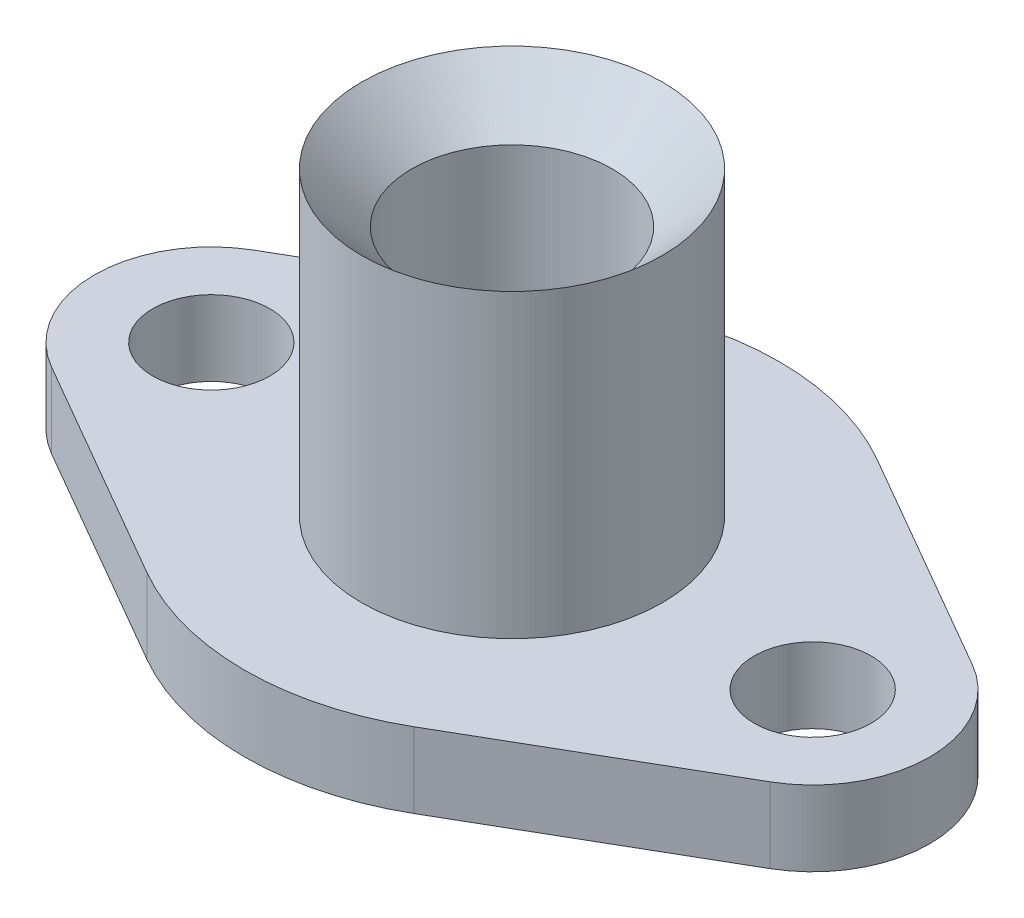
ISO-10303-21;
HEADER;
FILE_DESCRIPTION(('STEP AP214'),'2;1');
FILE_NAME('part.step','',(''),(''),'','','');
FILE_SCHEMA(('AUTOMOTIVE_DESIGN { 1 0 10303 214 1 1 1 1 }'));
ENDSEC;
DATA;
#1=APPLICATION_CONTEXT('core data for automotive mechanical design processes');
#2=APPLICATION_PROTOCOL_DEFINITION('international standard','automotive_design',2000,#1);
#3=PRODUCT_CONTEXT('',#1,'mechanical');
#4=PRODUCT('Part','Part','',(#3));
#5=PRODUCT_RELATED_PRODUCT_CATEGORY('part','',(#4));
#6=PRODUCT_DEFINITION_FORMATION('','',#4);
#7=PRODUCT_DEFINITION_CONTEXT('part definition',#1,'design');
#8=PRODUCT_DEFINITION('design','',#6,#7);
#9=PRODUCT_DEFINITION_SHAPE('','',#8);
#10=(LENGTH_UNIT() NAMED_UNIT(*) SI_UNIT(.MILLI.,.METRE.));
#11=(NAMED_UNIT(*) PLANE_ANGLE_UNIT() SI_UNIT($,.RADIAN.));
#12=(NAMED_UNIT(*) SI_UNIT($,.STERADIAN.) SOLID_ANGLE_UNIT());
#13=UNCERTAINTY_MEASURE_WITH_UNIT(LENGTH_MEASURE(1.E-05),#10,'distance_accuracy_value','');
#14=(GEOMETRIC_REPRESENTATION_CONTEXT(3) GLOBAL_UNCERTAINTY_ASSIGNED_CONTEXT((#13)) GLOBAL_UNIT_ASSIGNED_CONTEXT((#10,
#11,#12)) REPRESENTATION_CONTEXT('',''));
#15=CARTESIAN_POINT('',(0.,0.,0.));
#16=DIRECTION('',(0.,0.,1.));
#17=DIRECTION('',(1.,0.,0.));
#18=AXIS2_PLACEMENT_3D('',#15,#16,#17);
#19=CARTESIAN_POINT('',(-53.082252649215,9.,-67.5974700843521));
#20=DIRECTION('',(0.5,0.,-0.866025403784439));
#21=DIRECTION('',(-0.866025403784439,0.,-0.5));
#22=AXIS2_PLACEMENT_3D('',#19,#20,#21);
#23=PLANE('',#22);
#24=DIRECTION('',(0.866025403784439,0.,0.5));
#25=VECTOR('',#24,1.);
#26=CARTESIAN_POINT('',(-53.082252649215,0.,-67.5974700843521));
#27=LINE('',#26,#25);
#28=CARTESIAN_POINT('',(16.,0.,-27.712812921102));
#29=VERTEX_POINT('',#28);
#30=CARTESIAN_POINT('',(43.,0.,-12.1243556529821));
#31=VERTEX_POINT('',#30);
#32=EDGE_CURVE('E191',#29,#31,#27,.T.);
#33=ORIENTED_EDGE('',*,*,#32,.F.);
#34=DIRECTION('',(0.,-1.,0.));
#35=VECTOR('',#34,1.);
#36=CARTESIAN_POINT('',(16.,9.,-27.712812921102));
#37=LINE('',#36,#35);
#38=CARTESIAN_POINT('',(16.,9.,-27.712812921102));
#39=VERTEX_POINT('',#38);
#40=EDGE_CURVE('E87',#39,#29,#37,.T.);
#41=ORIENTED_EDGE('',*,*,#40,.F.);
#42=DIRECTION('',(0.866025403784439,0.,0.5));
#43=VECTOR('',#42,1.);
#44=CARTESIAN_POINT('',(-53.082252649215,9.,-67.5974700843521));
#45=LINE('',#44,#43);
#46=CARTESIAN_POINT('',(43.,9.,-12.1243556529821));
#47=VERTEX_POINT('',#46);
#48=EDGE_CURVE('E233',#39,#47,#45,.T.);
#49=ORIENTED_EDGE('',*,*,#48,.T.);
#50=DIRECTION('',(0.,-1.,0.));
#51=VECTOR('',#50,1.);
#52=CARTESIAN_POINT('',(43.,9.,-12.1243556529821));
#53=LINE('',#52,#51);
#54=EDGE_CURVE('E83',#47,#31,#53,.T.);
#55=ORIENTED_EDGE('',*,*,#54,.T.);
#56=EDGE_LOOP('',(#33,#41,#49,#55));
#57=FACE_BOUND('',#56,.T.);
#58=ADVANCED_FACE('F31',(#57),#23,.T.);
#59=CARTESIAN_POINT('',(0.,9.,0.));
#60=DIRECTION('',(0.,-1.,0.));
#61=DIRECTION('',(0.,0.,-1.));
#62=AXIS2_PLACEMENT_3D('',#59,#60,#61);
#63=CYLINDRICAL_SURFACE('',#62,32.);
#64=CARTESIAN_POINT('',(0.,0.,0.));
#65=DIRECTION('',(0.,1.,0.));
#66=DIRECTION('',(0.,0.,1.));
#67=AXIS2_PLACEMENT_3D('',#64,#65,#66);
#68=CIRCLE('',#67,32.);
#69=CARTESIAN_POINT('',(-16.,0.,-27.712812921102));
#70=VERTEX_POINT('',#69);
#71=EDGE_CURVE('E194',#29,#70,#68,.T.);
#72=ORIENTED_EDGE('',*,*,#71,.T.);
#73=DIRECTION('',(0.,-1.,0.));
#74=VECTOR('',#73,1.);
#75=CARTESIAN_POINT('',(-16.,9.,-27.712812921102));
#76=LINE('',#75,#74);
#77=CARTESIAN_POINT('',(-16.,9.,-27.712812921102));
#78=VERTEX_POINT('',#77);
#79=EDGE_CURVE('E137',#78,#70,#76,.T.);
#80=ORIENTED_EDGE('',*,*,#79,.F.);
#81=CARTESIAN_POINT('',(0.,9.,0.));
#82=DIRECTION('',(0.,1.,0.));
#83=DIRECTION('',(0.,0.,1.));
#84=AXIS2_PLACEMENT_3D('',#81,#82,#83);
#85=CIRCLE('',#84,32.);
#86=EDGE_CURVE('E123',#39,#78,#85,.T.);
#87=ORIENTED_EDGE('',*,*,#86,.F.);
#88=ORIENTED_EDGE('',*,*,#40,.T.);
#89=EDGE_LOOP('',(#72,#80,#87,#88));
#90=FACE_BOUND('',#89,.T.);
#91=ADVANCED_FACE('F158',(#90),#63,.T.);
#92=CARTESIAN_POINT('',(-85.082252649215,9.,12.171844242148));
#93=DIRECTION('',(0.5,0.,0.866025403784439));
#94=DIRECTION('',(0.866025403784439,0.,-0.5));
#95=AXIS2_PLACEMENT_3D('',#92,#93,#94);
#96=PLANE('',#95);
#97=DIRECTION('',(-0.866025403784439,0.,0.5));
#98=VECTOR('',#97,1.);
#99=CARTESIAN_POINT('',(-85.082252649215,0.,12.171844242148));
#100=LINE('',#99,#98);
#101=CARTESIAN_POINT('',(-43.,0.,-12.1243556529821));
#102=VERTEX_POINT('',#101);
#103=EDGE_CURVE('E203',#70,#102,#100,.T.);
#104=ORIENTED_EDGE('',*,*,#103,.T.);
#105=DIRECTION('',(0.,-1.,0.));
#106=VECTOR('',#105,1.);
#107=CARTESIAN_POINT('',(-43.,9.,-12.1243556529821));
#108=LINE('',#107,#106);
#109=CARTESIAN_POINT('',(-43.,9.,-12.1243556529821));
#110=VERTEX_POINT('',#109);
#111=EDGE_CURVE('E135',#110,#102,#108,.T.);
#112=ORIENTED_EDGE('',*,*,#111,.F.);
#113=DIRECTION('',(-0.866025403784439,0.,0.5));
#114=VECTOR('',#113,1.);
#115=CARTESIAN_POINT('',(-85.082252649215,9.,12.171844242148));
#116=LINE('',#115,#114);
#117=EDGE_CURVE('E230',#78,#110,#116,.T.);
#118=ORIENTED_EDGE('',*,*,#117,.F.);
#119=ORIENTED_EDGE('',*,*,#79,.T.);
#120=EDGE_LOOP('',(#104,#112,#118,#119));
#121=FACE_BOUND('',#120,.T.);
#122=ADVANCED_FACE('F163',(#121),#96,.F.);
#123=CARTESIAN_POINT('',(-36.,9.,0.));
#124=DIRECTION('',(0.,-1.,0.));
#125=DIRECTION('',(0.,0.,-1.));
#126=AXIS2_PLACEMENT_3D('',#123,#124,#125);
#127=CYLINDRICAL_SURFACE('',#126,14.);
#128=CARTESIAN_POINT('',(-36.,0.,0.));
#129=DIRECTION('',(0.,1.,0.));
#130=DIRECTION('',(0.,0.,1.));
#131=AXIS2_PLACEMENT_3D('',#128,#129,#130);
#132=CIRCLE('',#131,14.);
#133=CARTESIAN_POINT('',(-43.,0.,12.1243556529821));
#134=VERTEX_POINT('',#133);
#135=EDGE_CURVE('E206',#134,#102,#132,.F.);
#136=ORIENTED_EDGE('',*,*,#135,.F.);
#137=DIRECTION('',(0.,-1.,0.));
#138=VECTOR('',#137,1.);
#139=CARTESIAN_POINT('',(-43.,9.,12.1243556529821));
#140=LINE('',#139,#138);
#141=CARTESIAN_POINT('',(-43.,9.,12.1243556529821));
#142=VERTEX_POINT('',#141);
#143=EDGE_CURVE('E129',#142,#134,#140,.T.);
#144=ORIENTED_EDGE('',*,*,#143,.F.);
#145=CARTESIAN_POINT('',(-36.,9.,0.));
#146=DIRECTION('',(0.,1.,0.));
#147=DIRECTION('',(0.,0.,1.));
#148=AXIS2_PLACEMENT_3D('',#145,#146,#147);
#149=CIRCLE('',#148,14.);
#150=EDGE_CURVE('E227',#142,#110,#149,.F.);
#151=ORIENTED_EDGE('',*,*,#150,.T.);
#152=ORIENTED_EDGE('',*,*,#111,.T.);
#153=EDGE_LOOP('',(#136,#144,#151,#152));
#154=FACE_BOUND('',#153,.T.);
#155=ADVANCED_FACE('F241',(#154),#127,.T.);
#156=CARTESIAN_POINT('',(-85.082252649215,9.,-12.171844242148));
#157=DIRECTION('',(-0.5,0.,0.866025403784439));
#158=DIRECTION('',(0.866025403784439,0.,0.5));
#159=AXIS2_PLACEMENT_3D('',#156,#157,#158);
#160=PLANE('',#159);
#161=DIRECTION('',(-0.866025403784439,0.,-0.5));
#162=VECTOR('',#161,1.);
#163=CARTESIAN_POINT('',(-85.082252649215,0.,-12.171844242148));
#164=LINE('',#163,#162);
#165=CARTESIAN_POINT('',(-16.,0.,27.712812921102));
#166=VERTEX_POINT('',#165);
#167=EDGE_CURVE('E209',#166,#134,#164,.T.);
#168=ORIENTED_EDGE('',*,*,#167,.F.);
#169=DIRECTION('',(0.,-1.,0.));
#170=VECTOR('',#169,1.);
#171=CARTESIAN_POINT('',(-16.,9.,27.712812921102));
#172=LINE('',#171,#170);
#173=CARTESIAN_POINT('',(-16.,9.,27.712812921102));
#174=VERTEX_POINT('',#173);
#175=EDGE_CURVE('E127',#174,#166,#172,.T.);
#176=ORIENTED_EDGE('',*,*,#175,.F.);
#177=DIRECTION('',(-0.866025403784439,0.,-0.5));
#178=VECTOR('',#177,1.);
#179=CARTESIAN_POINT('',(-85.082252649215,9.,-12.171844242148));
#180=LINE('',#179,#178);
#181=EDGE_CURVE('E120',#174,#142,#180,.T.);
#182=ORIENTED_EDGE('',*,*,#181,.T.);
#183=ORIENTED_EDGE('',*,*,#143,.T.);
#184=EDGE_LOOP('',(#168,#176,#182,#183));
#185=FACE_BOUND('',#184,.T.);
#186=ADVANCED_FACE('F244',(#185),#160,.T.);
#187=CARTESIAN_POINT('',(16.,0.,27.712812921102));
#188=VERTEX_POINT('',#187);
#189=EDGE_CURVE('E126',#166,#188,#68,.T.);
#190=ORIENTED_EDGE('',*,*,#189,.T.);
#191=DIRECTION('',(0.,-1.,0.));
#192=VECTOR('',#191,1.);
#193=CARTESIAN_POINT('',(16.,9.,27.712812921102));
#194=LINE('',#193,#192);
#195=CARTESIAN_POINT('',(16.,9.,27.712812921102));
#196=VERTEX_POINT('',#195);
#197=EDGE_CURVE('E109',#196,#188,#194,.T.);
#198=ORIENTED_EDGE('',*,*,#197,.F.);
#199=EDGE_CURVE('E112',#174,#196,#85,.T.);
#200=ORIENTED_EDGE('',*,*,#199,.F.);
#201=ORIENTED_EDGE('',*,*,#175,.T.);
#202=EDGE_LOOP('',(#190,#198,#200,#201));
#203=FACE_BOUND('',#202,.T.);
#204=ADVANCED_FACE('F124',(#203),#63,.T.);
#205=CARTESIAN_POINT('',(-53.082252649215,9.,67.5974700843521));
#206=DIRECTION('',(-0.5,0.,-0.866025403784439));
#207=DIRECTION('',(-0.866025403784439,0.,0.5));
#208=AXIS2_PLACEMENT_3D('',#205,#206,#207);
#209=PLANE('',#208);
#210=DIRECTION('',(0.866025403784439,0.,-0.5));
#211=VECTOR('',#210,1.);
#212=CARTESIAN_POINT('',(-53.082252649215,0.,67.5974700843521));
#213=LINE('',#212,#211);
#214=CARTESIAN_POINT('',(43.,0.,12.1243556529821));
#215=VERTEX_POINT('',#214);
#216=EDGE_CURVE('E212',#188,#215,#213,.T.);
#217=ORIENTED_EDGE('',*,*,#216,.T.);
#218=DIRECTION('',(0.,-1.,0.));
#219=VECTOR('',#218,1.);
#220=CARTESIAN_POINT('',(43.,9.,12.1243556529821));
#221=LINE('',#220,#219);
#222=CARTESIAN_POINT('',(43.,9.,12.1243556529821));
#223=VERTEX_POINT('',#222);
#224=EDGE_CURVE('E111',#223,#215,#221,.T.);
#225=ORIENTED_EDGE('',*,*,#224,.F.);
#226=DIRECTION('',(0.866025403784439,0.,-0.5));
#227=VECTOR('',#226,1.);
#228=CARTESIAN_POINT('',(-53.082252649215,9.,67.5974700843521));
#229=LINE('',#228,#227);
#230=EDGE_CURVE('E104',#196,#223,#229,.T.);
#231=ORIENTED_EDGE('',*,*,#230,.F.);
#232=ORIENTED_EDGE('',*,*,#197,.T.);
#233=EDGE_LOOP('',(#217,#225,#231,#232));
#234=FACE_BOUND('',#233,.T.);
#235=ADVANCED_FACE('F107',(#234),#209,.F.);
#236=CARTESIAN_POINT('',(36.,9.,0.));
#237=DIRECTION('',(0.,-1.,0.));
#238=DIRECTION('',(0.,0.,-1.));
#239=AXIS2_PLACEMENT_3D('',#236,#237,#238);
#240=CYLINDRICAL_SURFACE('',#239,7.);
#241=CARTESIAN_POINT('',(36.,9.,0.));
#242=DIRECTION('',(0.,1.,0.));
#243=DIRECTION('',(0.,0.,1.));
#244=AXIS2_PLACEMENT_3D('',#241,#242,#243);
#245=CIRCLE('',#244,7.);
#246=CARTESIAN_POINT('',(36.,9.,7.));
#247=VERTEX_POINT('',#246);
#248=EDGE_CURVE('E218',#247,#247,#245,.T.);
#249=ORIENTED_EDGE('',*,*,#248,.T.);
#250=EDGE_LOOP('',(#249));
#251=FACE_BOUND('',#250,.T.);
#252=CARTESIAN_POINT('',(36.,0.,0.));
#253=DIRECTION('',(0.,1.,0.));
#254=DIRECTION('',(0.,0.,1.));
#255=AXIS2_PLACEMENT_3D('',#252,#253,#254);
#256=CIRCLE('',#255,7.);
#257=CARTESIAN_POINT('',(36.,0.,7.));
#258=VERTEX_POINT('',#257);
#259=EDGE_CURVE('E215',#258,#258,#256,.T.);
#260=ORIENTED_EDGE('',*,*,#259,.F.);
#261=EDGE_LOOP('',(#260));
#262=FACE_BOUND('',#261,.T.);
#263=ADVANCED_FACE('F180',(#251,#262),#240,.F.);
#264=CARTESIAN_POINT('',(36.,9.,0.));
#265=DIRECTION('',(0.,-1.,0.));
#266=DIRECTION('',(0.,0.,-1.));
#267=AXIS2_PLACEMENT_3D('',#264,#265,#266);
#268=CYLINDRICAL_SURFACE('',#267,14.);
#269=CARTESIAN_POINT('',(36.,0.,0.));
#270=DIRECTION('',(0.,1.,0.));
#271=DIRECTION('',(0.,0.,1.));
#272=AXIS2_PLACEMENT_3D('',#269,#270,#271);
#273=CIRCLE('',#272,14.);
#274=EDGE_CURVE('E76',#215,#31,#273,.T.);
#275=ORIENTED_EDGE('',*,*,#274,.T.);
#276=ORIENTED_EDGE('',*,*,#54,.F.);
#277=CARTESIAN_POINT('',(36.,9.,0.));
#278=DIRECTION('',(0.,1.,0.));
#279=DIRECTION('',(0.,0.,1.));
#280=AXIS2_PLACEMENT_3D('',#277,#278,#279);
#281=CIRCLE('',#280,14.);
#282=EDGE_CURVE('E48',#223,#47,#281,.T.);
#283=ORIENTED_EDGE('',*,*,#282,.F.);
#284=ORIENTED_EDGE('',*,*,#224,.T.);
#285=EDGE_LOOP('',(#275,#276,#283,#284));
#286=FACE_BOUND('',#285,.T.);
#287=ADVANCED_FACE('F171',(#286),#268,.T.);
#288=CARTESIAN_POINT('',(-36.,9.,0.));
#289=DIRECTION('',(0.,-1.,0.));
#290=DIRECTION('',(0.,0.,-1.));
#291=AXIS2_PLACEMENT_3D('',#288,#289,#290);
#292=CYLINDRICAL_SURFACE('',#291,7.);
#293=CARTESIAN_POINT('',(-36.,9.,0.));
#294=DIRECTION('',(0.,1.,0.));
#295=DIRECTION('',(0.,0.,1.));
#296=AXIS2_PLACEMENT_3D('',#293,#294,#295);
#297=CIRCLE('',#296,7.);
#298=CARTESIAN_POINT('',(-36.,9.,7.));
#299=VERTEX_POINT('',#298);
#300=EDGE_CURVE('E186',#299,#299,#297,.F.);
#301=ORIENTED_EDGE('',*,*,#300,.F.);
#302=EDGE_LOOP('',(#301));
#303=FACE_BOUND('',#302,.T.);
#304=CARTESIAN_POINT('',(-36.,0.,0.));
#305=DIRECTION('',(0.,1.,0.));
#306=DIRECTION('',(0.,0.,1.));
#307=AXIS2_PLACEMENT_3D('',#304,#305,#306);
#308=CIRCLE('',#307,7.);
#309=CARTESIAN_POINT('',(-36.,0.,7.));
#310=VERTEX_POINT('',#309);
#311=EDGE_CURVE('E189',#310,#310,#308,.F.);
#312=ORIENTED_EDGE('',*,*,#311,.T.);
#313=EDGE_LOOP('',(#312));
#314=FACE_BOUND('',#313,.T.);
#315=ADVANCED_FACE('F169',(#303,#314),#292,.F.);
#316=CARTESIAN_POINT('',(-92.1096701989533,9.,0.));
#317=DIRECTION('',(0.,1.,0.));
#318=DIRECTION('',(0.,0.,1.));
#319=AXIS2_PLACEMENT_3D('',#316,#317,#318);
#320=PLANE('',#319);
#321=ORIENTED_EDGE('',*,*,#300,.T.);
#322=EDGE_LOOP('',(#321));
#323=FACE_BOUND('',#322,.T.);
#324=ORIENTED_EDGE('',*,*,#48,.F.);
#325=ORIENTED_EDGE('',*,*,#86,.T.);
#326=ORIENTED_EDGE('',*,*,#117,.T.);
#327=ORIENTED_EDGE('',*,*,#150,.F.);
#328=ORIENTED_EDGE('',*,*,#181,.F.);
#329=ORIENTED_EDGE('',*,*,#199,.T.);
#330=ORIENTED_EDGE('',*,*,#230,.T.);
#331=ORIENTED_EDGE('',*,*,#282,.T.);
#332=EDGE_LOOP('',(#324,#325,#326,#327,#328,#329,#330,#331));
#333=FACE_BOUND('',#332,.T.);
#334=ORIENTED_EDGE('',*,*,#248,.F.);
#335=EDGE_LOOP('',(#334));
#336=FACE_BOUND('',#335,.T.);
#337=CARTESIAN_POINT('',(0.,9.,0.));
#338=DIRECTION('',(0.,1.,0.));
#339=DIRECTION('',(0.,0.,1.));
#340=AXIS2_PLACEMENT_3D('',#337,#338,#339);
#341=CIRCLE('',#340,18.);
#342=CARTESIAN_POINT('',(0.,9.,-18.));
#343=VERTEX_POINT('',#342);
#344=EDGE_CURVE('E198',#343,#343,#341,.T.);
#345=ORIENTED_EDGE('',*,*,#344,.F.);
#346=EDGE_LOOP('',(#345));
#347=FACE_BOUND('',#346,.T.);
#348=ADVANCED_FACE('F116',(#323,#333,#336,#347),#320,.T.);
#349=CARTESIAN_POINT('',(-92.1096701989533,0.,0.));
#350=DIRECTION('',(0.,1.,0.));
#351=DIRECTION('',(0.,0.,1.));
#352=AXIS2_PLACEMENT_3D('',#349,#350,#351);
#353=PLANE('',#352);
#354=CARTESIAN_POINT('',(0.,0.,0.));
#355=DIRECTION('',(0.,1.,0.));
#356=DIRECTION('',(0.,0.,1.));
#357=AXIS2_PLACEMENT_3D('',#354,#355,#356);
#358=CIRCLE('',#357,17.9999999999999);
#359=CARTESIAN_POINT('',(0.,0.,-17.9999999999999));
#360=VERTEX_POINT('',#359);
#361=EDGE_CURVE('E141',#360,#360,#358,.T.);
#362=ORIENTED_EDGE('',*,*,#361,.T.);
#363=EDGE_LOOP('',(#362));
#364=FACE_BOUND('',#363,.T.);
#365=ORIENTED_EDGE('',*,*,#311,.F.);
#366=EDGE_LOOP('',(#365));
#367=FACE_BOUND('',#366,.T.);
#368=ORIENTED_EDGE('',*,*,#32,.T.);
#369=ORIENTED_EDGE('',*,*,#274,.F.);
#370=ORIENTED_EDGE('',*,*,#216,.F.);
#371=ORIENTED_EDGE('',*,*,#189,.F.);
#372=ORIENTED_EDGE('',*,*,#167,.T.);
#373=ORIENTED_EDGE('',*,*,#135,.T.);
#374=ORIENTED_EDGE('',*,*,#103,.F.);
#375=ORIENTED_EDGE('',*,*,#71,.F.);
#376=EDGE_LOOP('',(#368,#369,#370,#371,#372,#373,#374,#375));
#377=FACE_BOUND('',#376,.T.);
#378=ORIENTED_EDGE('',*,*,#259,.T.);
#379=EDGE_LOOP('',(#378));
#380=FACE_BOUND('',#379,.T.);
#381=ADVANCED_FACE('F177',(#364,#367,#377,#380),#353,.F.);
#382=CARTESIAN_POINT('',(0.,45.,0.));
#383=DIRECTION('',(0.,-1.,0.));
#384=DIRECTION('',(0.,0.,-1.));
#385=AXIS2_PLACEMENT_3D('',#382,#383,#384);
#386=CYLINDRICAL_SURFACE('',#385,12.);
#387=CARTESIAN_POINT('',(0.,5.99999999999999,0.));
#388=DIRECTION('',(0.,1.,0.));
#389=DIRECTION('',(0.,0.,1.));
#390=AXIS2_PLACEMENT_3D('',#387,#388,#389);
#391=CIRCLE('',#390,12.);
#392=CARTESIAN_POINT('',(0.,5.99999999999998,-12.));
#393=VERTEX_POINT('',#392);
#394=EDGE_CURVE('E11',#393,#393,#391,.F.);
#395=CARTESIAN_POINT('',(0.,39.,0.));
#396=DIRECTION('',(0.,1.,0.));
#397=DIRECTION('',(0.,0.,1.));
#398=AXIS2_PLACEMENT_3D('',#395,#396,#397);
#399=CIRCLE('',#398,12.);
#400=CARTESIAN_POINT('',(0.,39.,-12.));
#401=VERTEX_POINT('',#400);
#402=EDGE_CURVE('E40',#401,#401,#399,.T.);
#403=CARTESIAN_POINT('',(0.,5.99999999999998,-12.));
#404=CARTESIAN_POINT('',(0.,6.34374999999998,-12.));
#405=CARTESIAN_POINT('',(0.,6.68749999999998,-12.));
#406=CARTESIAN_POINT('',(0.,7.37499999999998,-12.));
#407=CARTESIAN_POINT('',(0.,7.71874999999998,-12.));
#408=CARTESIAN_POINT('',(0.,8.40624999999998,-12.));
#409=CARTESIAN_POINT('',(0.,8.74999999999998,-12.));
#410=CARTESIAN_POINT('',(0.,9.43749999999998,-12.));
#411=CARTESIAN_POINT('',(0.,9.78124999999998,-12.));
#412=CARTESIAN_POINT('',(0.,10.46875,-12.));
#413=CARTESIAN_POINT('',(0.,10.8125,-12.));
#414=CARTESIAN_POINT('',(0.,11.5,-12.));
#415=CARTESIAN_POINT('',(0.,11.84375,-12.));
#416=CARTESIAN_POINT('',(0.,12.53125,-12.));
#417=CARTESIAN_POINT('',(0.,12.875,-12.));
#418=CARTESIAN_POINT('',(0.,13.5625,-12.));
#419=CARTESIAN_POINT('',(0.,13.90625,-12.));
#420=CARTESIAN_POINT('',(0.,14.59375,-12.));
#421=CARTESIAN_POINT('',(0.,14.9375,-12.));
#422=CARTESIAN_POINT('',(0.,15.625,-12.));
#423=CARTESIAN_POINT('',(0.,15.96875,-12.));
#424=CARTESIAN_POINT('',(0.,16.65625,-12.));
#425=CARTESIAN_POINT('',(0.,17.,-12.));
#426=CARTESIAN_POINT('',(0.,17.6875,-12.));
#427=CARTESIAN_POINT('',(0.,18.03125,-12.));
#428=CARTESIAN_POINT('',(0.,18.71875,-12.));
#429=CARTESIAN_POINT('',(0.,19.0625,-12.));
#430=CARTESIAN_POINT('',(0.,19.75,-12.));
#431=CARTESIAN_POINT('',(0.,20.09375,-12.));
#432=CARTESIAN_POINT('',(0.,20.78125,-12.));
#433=CARTESIAN_POINT('',(0.,21.125,-12.));
#434=CARTESIAN_POINT('',(0.,21.8125,-12.));
#435=CARTESIAN_POINT('',(0.,22.15625,-12.));
#436=CARTESIAN_POINT('',(0.,22.84375,-12.));
#437=CARTESIAN_POINT('',(0.,23.1875,-12.));
#438=CARTESIAN_POINT('',(0.,23.875,-12.));
#439=CARTESIAN_POINT('',(0.,24.21875,-12.));
#440=CARTESIAN_POINT('',(0.,24.90625,-12.));
#441=CARTESIAN_POINT('',(0.,25.25,-12.));
#442=CARTESIAN_POINT('',(0.,25.9375,-12.));
#443=CARTESIAN_POINT('',(0.,26.28125,-12.));
#444=CARTESIAN_POINT('',(0.,26.96875,-12.));
#445=CARTESIAN_POINT('',(0.,27.3125,-12.));
#446=CARTESIAN_POINT('',(0.,28.,-12.));
#447=CARTESIAN_POINT('',(0.,28.34375,-12.));
#448=CARTESIAN_POINT('',(0.,29.03125,-12.));
#449=CARTESIAN_POINT('',(0.,29.375,-12.));
#450=CARTESIAN_POINT('',(0.,30.0625,-12.));
#451=CARTESIAN_POINT('',(0.,30.40625,-12.));
#452=CARTESIAN_POINT('',(0.,31.09375,-12.));
#453=CARTESIAN_POINT('',(0.,31.4375,-12.));
#454=CARTESIAN_POINT('',(0.,32.125,-12.));
#455=CARTESIAN_POINT('',(0.,32.46875,-12.));
#456=CARTESIAN_POINT('',(0.,33.15625,-12.));
#457=CARTESIAN_POINT('',(0.,33.5,-12.));
#458=CARTESIAN_POINT('',(0.,34.1875,-12.));
#459=CARTESIAN_POINT('',(0.,34.53125,-12.));
#460=CARTESIAN_POINT('',(0.,35.21875,-12.));
#461=CARTESIAN_POINT('',(0.,35.5625,-12.));
#462=CARTESIAN_POINT('',(0.,36.25,-12.));
#463=CARTESIAN_POINT('',(0.,36.59375,-12.));
#464=CARTESIAN_POINT('',(0.,37.28125,-12.));
#465=CARTESIAN_POINT('',(0.,37.625,-12.));
#466=CARTESIAN_POINT('',(0.,38.3125,-12.));
#467=CARTESIAN_POINT('',(0.,38.65625,-12.));
#468=CARTESIAN_POINT('',(0.,39.,-12.));
#469=B_SPLINE_CURVE_WITH_KNOTS('',3,(#403,#404,#405,#406,#407,#408,#409,#410,#411,#412,#413,
#414,#415,#416,#417,#418,#419,#420,#421,#422,#423,#424,#425,#426,#427,#428,#429,#430,#431,#432,
#433,#434,#435,#436,#437,#438,#439,#440,#441,#442,#443,#444,#445,#446,#447,#448,#449,#450,#451,
#452,#453,#454,#455,#456,#457,#458,#459,#460,#461,#462,#463,#464,#465,#466,#467,#468),
.UNSPECIFIED.,.F.,.F.,(4,2,2,2,2,2,2,2,2,2,2,2,2,2,2,2,2,2,2,2,2,2,2,2,2,2,2,2,2,2,2,2,4),(0.,
1.03125,2.06249999999999,3.09375,4.125,5.15624999999999,6.1875,7.21875,8.24999999999999,
9.28124999999999,10.3125,11.34375,12.375,13.40625,14.4375,15.46875,16.5,17.53125,18.5625,
19.59375,20.625,21.65625,22.6875,23.71875,24.75,25.78125,26.8125,27.84375,28.875,29.90625,
30.9375,31.96875,33.),.UNSPECIFIED.);
#470=EDGE_CURVE('BSEAM146',#393,#401,#469,.T.);
#471=ORIENTED_EDGE('',*,*,#394,.T.);
#472=ORIENTED_EDGE('',*,*,#402,.T.);
#473=ORIENTED_EDGE('',*,*,#470,.T.);
#474=ORIENTED_EDGE('',*,*,#470,.F.);
#475=EDGE_LOOP('',(#471,#473,#472,#474));
#476=FACE_BOUND('',#475,.T.);
#477=ADVANCED_FACE('F146',(#476),#386,.F.);
#478=CARTESIAN_POINT('',(0.,45.,0.));
#479=DIRECTION('',(0.,-1.,0.));
#480=DIRECTION('',(0.,0.,-1.));
#481=AXIS2_PLACEMENT_3D('',#478,#479,#480);
#482=CYLINDRICAL_SURFACE('',#481,18.);
#483=CARTESIAN_POINT('',(0.,45.,0.));
#484=DIRECTION('',(0.,1.,0.));
#485=DIRECTION('',(0.,0.,1.));
#486=AXIS2_PLACEMENT_3D('',#483,#484,#485);
#487=CIRCLE('',#486,18.);
#488=CARTESIAN_POINT('',(0.,45.,-18.));
#489=VERTEX_POINT('',#488);
#490=EDGE_CURVE('E192',#489,#489,#487,.T.);
#491=CARTESIAN_POINT('',(0.,9.,-18.));
#492=CARTESIAN_POINT('',(0.,9.375,-18.));
#493=CARTESIAN_POINT('',(0.,9.75,-18.));
#494=CARTESIAN_POINT('',(0.,10.5,-18.));
#495=CARTESIAN_POINT('',(0.,10.875,-18.));
#496=CARTESIAN_POINT('',(0.,11.625,-18.));
#497=CARTESIAN_POINT('',(0.,12.,-18.));
#498=CARTESIAN_POINT('',(0.,12.75,-18.));
#499=CARTESIAN_POINT('',(0.,13.125,-18.));
#500=CARTESIAN_POINT('',(0.,13.875,-18.));
#501=CARTESIAN_POINT('',(0.,14.25,-18.));
#502=CARTESIAN_POINT('',(0.,15.,-18.));
#503=CARTESIAN_POINT('',(0.,15.375,-18.));
#504=CARTESIAN_POINT('',(0.,16.125,-18.));
#505=CARTESIAN_POINT('',(0.,16.5,-18.));
#506=CARTESIAN_POINT('',(0.,17.25,-18.));
#507=CARTESIAN_POINT('',(0.,17.625,-18.));
#508=CARTESIAN_POINT('',(0.,18.375,-18.));
#509=CARTESIAN_POINT('',(0.,18.75,-18.));
#510=CARTESIAN_POINT('',(0.,19.5,-18.));
#511=CARTESIAN_POINT('',(0.,19.875,-18.));
#512=CARTESIAN_POINT('',(0.,20.625,-18.));
#513=CARTESIAN_POINT('',(0.,21.,-18.));
#514=CARTESIAN_POINT('',(0.,21.75,-18.));
#515=CARTESIAN_POINT('',(0.,22.125,-18.));
#516=CARTESIAN_POINT('',(0.,22.875,-18.));
#517=CARTESIAN_POINT('',(0.,23.25,-18.));
#518=CARTESIAN_POINT('',(0.,24.,-18.));
#519=CARTESIAN_POINT('',(0.,24.375,-18.));
#520=CARTESIAN_POINT('',(0.,25.125,-18.));
#521=CARTESIAN_POINT('',(0.,25.5,-18.));
#522=CARTESIAN_POINT('',(0.,26.25,-18.));
#523=CARTESIAN_POINT('',(0.,26.625,-18.));
#524=CARTESIAN_POINT('',(0.,27.375,-18.));
#525=CARTESIAN_POINT('',(0.,27.75,-18.));
#526=CARTESIAN_POINT('',(0.,28.5,-18.));
#527=CARTESIAN_POINT('',(0.,28.875,-18.));
#528=CARTESIAN_POINT('',(0.,29.625,-18.));
#529=CARTESIAN_POINT('',(0.,30.,-18.));
#530=CARTESIAN_POINT('',(0.,30.75,-18.));
#531=CARTESIAN_POINT('',(0.,31.125,-18.));
#532=CARTESIAN_POINT('',(0.,31.875,-18.));
#533=CARTESIAN_POINT('',(0.,32.25,-18.));
#534=CARTESIAN_POINT('',(0.,33.,-18.));
#535=CARTESIAN_POINT('',(0.,33.375,-18.));
#536=CARTESIAN_POINT('',(0.,34.125,-18.));
#537=CARTESIAN_POINT('',(0.,34.5,-18.));
#538=CARTESIAN_POINT('',(0.,35.25,-18.));
#539=CARTESIAN_POINT('',(0.,35.625,-18.));
#540=CARTESIAN_POINT('',(0.,36.375,-18.));
#541=CARTESIAN_POINT('',(0.,36.75,-18.));
#542=CARTESIAN_POINT('',(0.,37.5,-18.));
#543=CARTESIAN_POINT('',(0.,37.875,-18.));
#544=CARTESIAN_POINT('',(0.,38.625,-18.));
#545=CARTESIAN_POINT('',(0.,39.,-18.));
#546=CARTESIAN_POINT('',(0.,39.75,-18.));
#547=CARTESIAN_POINT('',(0.,40.125,-18.));
#548=CARTESIAN_POINT('',(0.,40.875,-18.));
#549=CARTESIAN_POINT('',(0.,41.25,-18.));
#550=CARTESIAN_POINT('',(0.,42.,-18.));
#551=CARTESIAN_POINT('',(0.,42.375,-18.));
#552=CARTESIAN_POINT('',(0.,43.125,-18.));
#553=CARTESIAN_POINT('',(0.,43.5,-18.));
#554=CARTESIAN_POINT('',(0.,44.25,-18.));
#555=CARTESIAN_POINT('',(0.,44.625,-18.));
#556=CARTESIAN_POINT('',(0.,45.,-18.));
#557=B_SPLINE_CURVE_WITH_KNOTS('',3,(#491,#492,#493,#494,#495,#496,#497,#498,#499,#500,#501,
#502,#503,#504,#505,#506,#507,#508,#509,#510,#511,#512,#513,#514,#515,#516,#517,#518,#519,#520,
#521,#522,#523,#524,#525,#526,#527,#528,#529,#530,#531,#532,#533,#534,#535,#536,#537,#538,#539,
#540,#541,#542,#543,#544,#545,#546,#547,#548,#549,#550,#551,#552,#553,#554,#555,#556),
.UNSPECIFIED.,.F.,.F.,(4,2,2,2,2,2,2,2,2,2,2,2,2,2,2,2,2,2,2,2,2,2,2,2,2,2,2,2,2,2,2,2,4),(0.,
1.125,2.25,3.375,4.5,5.62499999999999,6.75,7.875,9.,10.125,11.25,12.375,13.5,14.625,15.75,
16.875,18.,19.125,20.25,21.375,22.5,23.625,24.75,25.875,27.,28.125,29.25,30.375,31.5,32.625,
33.75,34.875,36.),.UNSPECIFIED.);
#558=EDGE_CURVE('BSEAM154',#343,#489,#557,.T.);
#559=ORIENTED_EDGE('',*,*,#344,.T.);
#560=ORIENTED_EDGE('',*,*,#490,.F.);
#561=ORIENTED_EDGE('',*,*,#558,.T.);
#562=ORIENTED_EDGE('',*,*,#558,.F.);
#563=EDGE_LOOP('',(#559,#561,#560,#562));
#564=FACE_BOUND('',#563,.T.);
#565=ADVANCED_FACE('F154',(#564),#482,.T.);
#566=CARTESIAN_POINT('',(0.,0.,0.));
#567=DIRECTION('',(0.,-1.,0.));
#568=DIRECTION('',(0.,0.,-1.));
#569=AXIS2_PLACEMENT_3D('',#566,#567,#568);
#570=CONICAL_SURFACE('',#569,17.9999999999999,0.785398163397445);
#571=CARTESIAN_POINT('',(0.,5.99999999999999,-12.));
#572=CARTESIAN_POINT('',(0.,5.93749999999999,-12.0625));
#573=CARTESIAN_POINT('',(0.,5.87499999999999,-12.125));
#574=CARTESIAN_POINT('',(0.,5.74999999999999,-12.25));
#575=CARTESIAN_POINT('',(0.,5.68749999999999,-12.3125));
#576=CARTESIAN_POINT('',(0.,5.56249999999999,-12.4375));
#577=CARTESIAN_POINT('',(0.,5.49999999999999,-12.5));
#578=CARTESIAN_POINT('',(0.,5.37499999999999,-12.625));
#579=CARTESIAN_POINT('',(0.,5.31249999999999,-12.6875));
#580=CARTESIAN_POINT('',(0.,5.18749999999999,-12.8125));
#581=CARTESIAN_POINT('',(0.,5.12499999999999,-12.875));
#582=CARTESIAN_POINT('',(0.,4.99999999999999,-13.));
#583=CARTESIAN_POINT('',(0.,4.93749999999999,-13.0625));
#584=CARTESIAN_POINT('',(0.,4.81249999999999,-13.1875));
#585=CARTESIAN_POINT('',(0.,4.74999999999999,-13.25));
#586=CARTESIAN_POINT('',(0.,4.62499999999999,-13.375));
#587=CARTESIAN_POINT('',(0.,4.56249999999999,-13.4375));
#588=CARTESIAN_POINT('',(0.,4.43749999999999,-13.5625));
#589=CARTESIAN_POINT('',(0.,4.37499999999999,-13.625));
#590=CARTESIAN_POINT('',(0.,4.24999999999999,-13.75));
#591=CARTESIAN_POINT('',(0.,4.18749999999999,-13.8125));
#592=CARTESIAN_POINT('',(0.,4.06249999999999,-13.9375));
#593=CARTESIAN_POINT('',(0.,3.99999999999999,-14.));
#594=CARTESIAN_POINT('',(0.,3.87499999999999,-14.125));
#595=CARTESIAN_POINT('',(0.,3.81249999999999,-14.1875));
#596=CARTESIAN_POINT('',(0.,3.68749999999999,-14.3125));
#597=CARTESIAN_POINT('',(0.,3.62499999999999,-14.375));
#598=CARTESIAN_POINT('',(0.,3.49999999999999,-14.5));
#599=CARTESIAN_POINT('',(0.,3.43749999999999,-14.5625));
#600=CARTESIAN_POINT('',(0.,3.31249999999999,-14.6875));
#601=CARTESIAN_POINT('',(0.,3.25,-14.75));
#602=CARTESIAN_POINT('',(0.,3.125,-14.875));
#603=CARTESIAN_POINT('',(0.,3.0625,-14.9375));
#604=CARTESIAN_POINT('',(0.,2.9375,-15.0625));
#605=CARTESIAN_POINT('',(0.,2.875,-15.125));
#606=CARTESIAN_POINT('',(0.,2.75,-15.25));
#607=CARTESIAN_POINT('',(0.,2.6875,-15.3125));
#608=CARTESIAN_POINT('',(0.,2.5625,-15.4375));
#609=CARTESIAN_POINT('',(0.,2.5,-15.5));
#610=CARTESIAN_POINT('',(0.,2.375,-15.625));
#611=CARTESIAN_POINT('',(0.,2.3125,-15.6875));
#612=CARTESIAN_POINT('',(0.,2.1875,-15.8125));
#613=CARTESIAN_POINT('',(0.,2.125,-15.875));
#614=CARTESIAN_POINT('',(0.,2.,-16.));
#615=CARTESIAN_POINT('',(0.,1.9375,-16.0625));
#616=CARTESIAN_POINT('',(0.,1.8125,-16.1875));
#617=CARTESIAN_POINT('',(0.,1.75,-16.25));
#618=CARTESIAN_POINT('',(0.,1.625,-16.375));
#619=CARTESIAN_POINT('',(0.,1.5625,-16.4375));
#620=CARTESIAN_POINT('',(0.,1.4375,-16.5625));
#621=CARTESIAN_POINT('',(0.,1.375,-16.625));
#622=CARTESIAN_POINT('',(0.,1.25,-16.75));
#623=CARTESIAN_POINT('',(0.,1.1875,-16.8125));
#624=CARTESIAN_POINT('',(0.,1.0625,-16.9375));
#625=CARTESIAN_POINT('',(0.,0.999999999999999,-17.));
#626=CARTESIAN_POINT('',(0.,0.874999999999999,-17.125));
#627=CARTESIAN_POINT('',(0.,0.812499999999999,-17.1875));
#628=CARTESIAN_POINT('',(0.,0.687499999999999,-17.3125));
#629=CARTESIAN_POINT('',(0.,0.624999999999999,-17.375));
#630=CARTESIAN_POINT('',(0.,0.499999999999999,-17.5));
#631=CARTESIAN_POINT('',(0.,0.437499999999999,-17.5625));
#632=CARTESIAN_POINT('',(0.,0.3125,-17.6875));
#633=CARTESIAN_POINT('',(0.,0.25,-17.7499999999999));
#634=CARTESIAN_POINT('',(0.,0.125,-17.8749999999999));
#635=CARTESIAN_POINT('',(0.,0.0624999999999997,-17.9374999999999));
#636=CARTESIAN_POINT('',(0.,0.,-17.9999999999999));
#637=B_SPLINE_CURVE_WITH_KNOTS('',3,(#571,#572,#573,#574,#575,#576,#577,#578,#579,#580,#581,
#582,#583,#584,#585,#586,#587,#588,#589,#590,#591,#592,#593,#594,#595,#596,#597,#598,#599,#600,
#601,#602,#603,#604,#605,#606,#607,#608,#609,#610,#611,#612,#613,#614,#615,#616,#617,#618,#619,
#620,#621,#622,#623,#624,#625,#626,#627,#628,#629,#630,#631,#632,#633,#634,#635,#636),
.UNSPECIFIED.,.F.,.F.,(4,2,2,2,2,2,2,2,2,2,2,2,2,2,2,2,2,2,2,2,2,2,2,2,2,2,2,2,2,2,2,2,4),(0.,
0.265165042944956,0.530330085889908,0.795495128834863,1.06066017177982,1.32582521472477,
1.59099025766973,1.85615530061468,2.12132034355963,2.38648538650459,2.65165042944954,
2.91681547239449,3.18198051533945,3.4471455582844,3.71231060122936,3.97747564417431,
4.24264068711927,4.50780573006422,4.77297077300917,5.03813581595413,5.30330085889908,
5.56846590184403,5.83363094478899,6.09879598773394,6.3639610306789,6.62912607362385,
6.89429111656881,7.15945615951376,7.42462120245871,7.68978624540367,7.95495128834862,
8.22011633129357,8.48528137423853),.UNSPECIFIED.);
#638=EDGE_CURVE('BSEAM149',#393,#360,#637,.T.);
#639=ORIENTED_EDGE('',*,*,#394,.F.);
#640=ORIENTED_EDGE('',*,*,#361,.F.);
#641=ORIENTED_EDGE('',*,*,#638,.T.);
#642=ORIENTED_EDGE('',*,*,#638,.F.);
#643=EDGE_LOOP('',(#639,#641,#640,#642));
#644=FACE_BOUND('',#643,.T.);
#645=ADVANCED_FACE('F149',(#644),#570,.F.);
#646=CARTESIAN_POINT('',(0.,39.,0.));
#647=DIRECTION('',(0.,1.,0.));
#648=DIRECTION('',(0.,0.,1.));
#649=AXIS2_PLACEMENT_3D('',#646,#647,#648);
#650=CONICAL_SURFACE('',#649,12.,0.785398163397451);
#651=ORIENTED_EDGE('',*,*,#490,.T.);
#652=EDGE_LOOP('',(#651));
#653=FACE_BOUND('',#652,.T.);
#654=ORIENTED_EDGE('',*,*,#402,.F.);
#655=EDGE_LOOP('',(#654));
#656=FACE_BOUND('',#655,.T.);
#657=ADVANCED_FACE('F33',(#653,#656),#650,.F.);
#658=CLOSED_SHELL('',(#58,#91,#122,#155,#186,#204,#235,#263,#287,#315,#348,#381,#477,#565,#645,#657));
#659=MANIFOLD_SOLID_BREP('B2',#658);
#660=ADVANCED_BREP_SHAPE_REPRESENTATION('',(#18,#659),#14);
#661=SHAPE_DEFINITION_REPRESENTATION(#9,#660);
ENDSEC;
END-ISO-10303-21;
